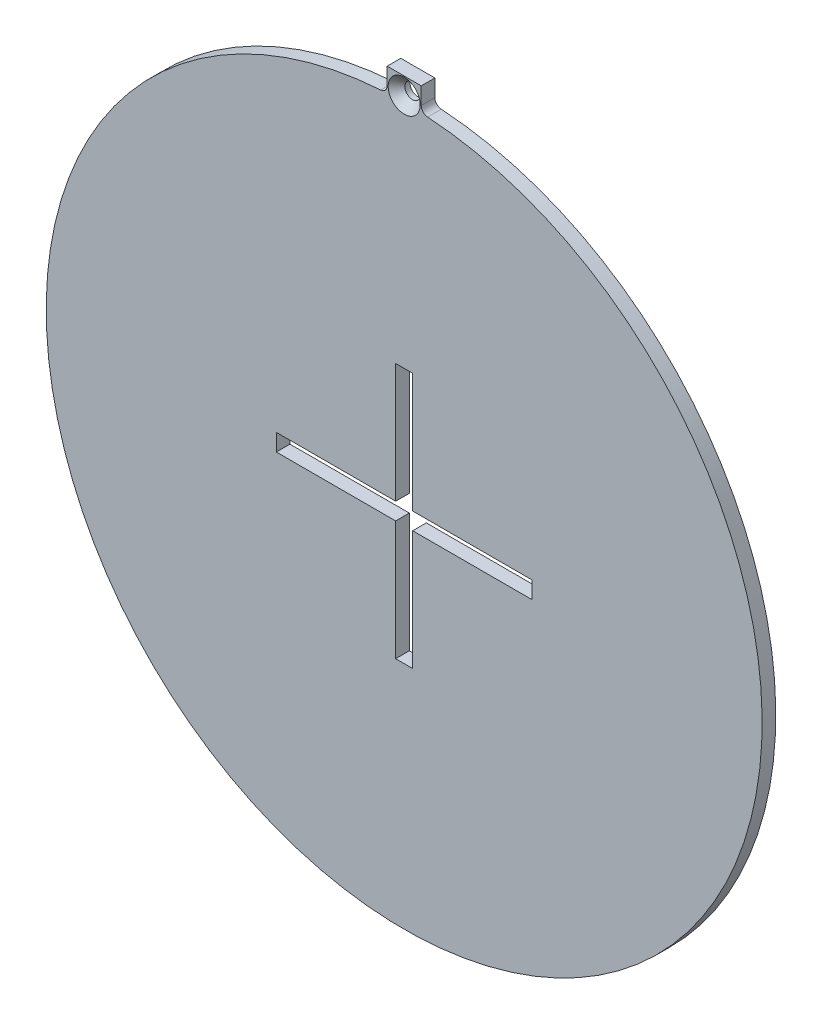
ISO-10303-21;
HEADER;
FILE_DESCRIPTION(('STEP AP214'),'2;1');
FILE_NAME('part.step','',(''),(''),'','','');
FILE_SCHEMA(('AUTOMOTIVE_DESIGN { 1 0 10303 214 1 1 1 1 }'));
ENDSEC;
DATA;
#1=APPLICATION_CONTEXT('core data for automotive mechanical design processes');
#2=APPLICATION_PROTOCOL_DEFINITION('international standard','automotive_design',2000,#1);
#3=PRODUCT_CONTEXT('',#1,'mechanical');
#4=PRODUCT('Part','Part','',(#3));
#5=PRODUCT_RELATED_PRODUCT_CATEGORY('part','',(#4));
#6=PRODUCT_DEFINITION_FORMATION('','',#4);
#7=PRODUCT_DEFINITION_CONTEXT('part definition',#1,'design');
#8=PRODUCT_DEFINITION('design','',#6,#7);
#9=PRODUCT_DEFINITION_SHAPE('','',#8);
#10=(LENGTH_UNIT() NAMED_UNIT(*) SI_UNIT(.MILLI.,.METRE.));
#11=(NAMED_UNIT(*) PLANE_ANGLE_UNIT() SI_UNIT($,.RADIAN.));
#12=(NAMED_UNIT(*) SI_UNIT($,.STERADIAN.) SOLID_ANGLE_UNIT());
#13=UNCERTAINTY_MEASURE_WITH_UNIT(LENGTH_MEASURE(1.E-05),#10,'distance_accuracy_value','');
#14=(GEOMETRIC_REPRESENTATION_CONTEXT(3) GLOBAL_UNCERTAINTY_ASSIGNED_CONTEXT((#13)) GLOBAL_UNIT_ASSIGNED_CONTEXT((#10,
#11,#12)) REPRESENTATION_CONTEXT('',''));
#15=CARTESIAN_POINT('',(0.,0.,0.));
#16=DIRECTION('',(0.,0.,1.));
#17=DIRECTION('',(1.,0.,0.));
#18=AXIS2_PLACEMENT_3D('',#15,#16,#17);
#19=CARTESIAN_POINT('',(7.,106.770782520313,4.));
#20=DIRECTION('',(0.,0.,-1.));
#21=DIRECTION('',(-1.,0.,0.));
#22=AXIS2_PLACEMENT_3D('',#19,#20,#21);
#23=PLANE('',#22);
#24=DIRECTION('',(-1.,0.,0.));
#25=VECTOR('',#24,1.);
#26=CARTESIAN_POINT('',(2.5,37.5,4.));
#27=LINE('',#26,#25);
#28=CARTESIAN_POINT('',(2.5,37.5,4.));
#29=VERTEX_POINT('',#28);
#30=CARTESIAN_POINT('',(-2.5,37.5,4.));
#31=VERTEX_POINT('',#30);
#32=EDGE_CURVE('E184',#29,#31,#27,.T.);
#33=ORIENTED_EDGE('',*,*,#32,.F.);
#34=DIRECTION('',(0.,1.,0.));
#35=VECTOR('',#34,1.);
#36=CARTESIAN_POINT('',(2.5,37.5,4.));
#37=LINE('',#36,#35);
#38=CARTESIAN_POINT('',(2.5,2.5,4.));
#39=VERTEX_POINT('',#38);
#40=EDGE_CURVE('E166',#39,#29,#37,.T.);
#41=ORIENTED_EDGE('',*,*,#40,.F.);
#42=DIRECTION('',(-1.,0.,0.));
#43=VECTOR('',#42,1.);
#44=CARTESIAN_POINT('',(37.5,2.49999999999999,4.));
#45=LINE('',#44,#43);
#46=CARTESIAN_POINT('',(37.5,2.49999999999998,4.));
#47=VERTEX_POINT('',#46);
#48=EDGE_CURVE('E175',#47,#39,#45,.T.);
#49=ORIENTED_EDGE('',*,*,#48,.F.);
#50=DIRECTION('',(0.,1.,0.));
#51=VECTOR('',#50,1.);
#52=CARTESIAN_POINT('',(37.5,2.49999999999999,4.));
#53=LINE('',#52,#51);
#54=CARTESIAN_POINT('',(37.5,-2.50000000000001,4.));
#55=VERTEX_POINT('',#54);
#56=EDGE_CURVE('E54',#55,#47,#53,.T.);
#57=ORIENTED_EDGE('',*,*,#56,.F.);
#58=DIRECTION('',(1.,0.,0.));
#59=VECTOR('',#58,1.);
#60=CARTESIAN_POINT('',(37.5,-2.50000000000001,4.));
#61=LINE('',#60,#59);
#62=CARTESIAN_POINT('',(2.5,-2.5,4.));
#63=VERTEX_POINT('',#62);
#64=EDGE_CURVE('E390',#63,#55,#61,.T.);
#65=ORIENTED_EDGE('',*,*,#64,.F.);
#66=DIRECTION('',(0.,1.,0.));
#67=VECTOR('',#66,1.);
#68=CARTESIAN_POINT('',(2.5,-2.5,4.));
#69=LINE('',#68,#67);
#70=CARTESIAN_POINT('',(2.49999999999999,-37.5,4.));
#71=VERTEX_POINT('',#70);
#72=EDGE_CURVE('E393',#71,#63,#69,.T.);
#73=ORIENTED_EDGE('',*,*,#72,.F.);
#74=DIRECTION('',(1.,0.,0.));
#75=VECTOR('',#74,1.);
#76=CARTESIAN_POINT('',(2.49999999999999,-37.5,4.));
#77=LINE('',#76,#75);
#78=CARTESIAN_POINT('',(-2.50000000000001,-37.5,4.));
#79=VERTEX_POINT('',#78);
#80=EDGE_CURVE('E396',#79,#71,#77,.T.);
#81=ORIENTED_EDGE('',*,*,#80,.F.);
#82=DIRECTION('',(0.,-1.,0.));
#83=VECTOR('',#82,1.);
#84=CARTESIAN_POINT('',(-2.5,-2.5,4.));
#85=LINE('',#84,#83);
#86=CARTESIAN_POINT('',(-2.5,-2.5,4.));
#87=VERTEX_POINT('',#86);
#88=EDGE_CURVE('E399',#87,#79,#85,.T.);
#89=ORIENTED_EDGE('',*,*,#88,.F.);
#90=DIRECTION('',(1.,0.,0.));
#91=VECTOR('',#90,1.);
#92=CARTESIAN_POINT('',(-2.5,-2.5,4.));
#93=LINE('',#92,#91);
#94=CARTESIAN_POINT('',(-37.5,-2.50000000000001,4.));
#95=VERTEX_POINT('',#94);
#96=EDGE_CURVE('E402',#95,#87,#93,.T.);
#97=ORIENTED_EDGE('',*,*,#96,.F.);
#98=DIRECTION('',(0.,-1.,0.));
#99=VECTOR('',#98,1.);
#100=CARTESIAN_POINT('',(-37.5,2.49999999999999,4.));
#101=LINE('',#100,#99);
#102=CARTESIAN_POINT('',(-37.5,2.49999999999999,4.));
#103=VERTEX_POINT('',#102);
#104=EDGE_CURVE('E405',#103,#95,#101,.T.);
#105=ORIENTED_EDGE('',*,*,#104,.F.);
#106=DIRECTION('',(-1.,0.,0.));
#107=VECTOR('',#106,1.);
#108=CARTESIAN_POINT('',(-2.5,2.5,4.));
#109=LINE('',#108,#107);
#110=CARTESIAN_POINT('',(-2.5,2.5,4.));
#111=VERTEX_POINT('',#110);
#112=EDGE_CURVE('E408',#111,#103,#109,.T.);
#113=ORIENTED_EDGE('',*,*,#112,.F.);
#114=DIRECTION('',(0.,-1.,0.));
#115=VECTOR('',#114,1.);
#116=CARTESIAN_POINT('',(-2.5,37.5,4.));
#117=LINE('',#116,#115);
#118=EDGE_CURVE('E188',#31,#111,#117,.T.);
#119=ORIENTED_EDGE('',*,*,#118,.F.);
#120=EDGE_LOOP('',(#33,#41,#49,#57,#65,#73,#81,#89,#97,#105,#113,#119));
#121=FACE_BOUND('',#120,.T.);
#122=DIRECTION('',(0.,-1.,0.));
#123=VECTOR('',#122,1.);
#124=CARTESIAN_POINT('',(-5.,106.770782520313,4.));
#125=LINE('',#124,#123);
#126=CARTESIAN_POINT('',(-5.,111.770782520313,4.));
#127=VERTEX_POINT('',#126);
#128=CARTESIAN_POINT('',(-5.,106.770782520313,4.));
#129=VERTEX_POINT('',#128);
#130=EDGE_CURVE('E242',#127,#129,#125,.T.);
#131=ORIENTED_EDGE('',*,*,#130,.T.);
#132=CARTESIAN_POINT('',(-7.,106.770782520313,4.));
#133=DIRECTION('',(0.,0.,-1.));
#134=DIRECTION('',(1.,0.,0.));
#135=AXIS2_PLACEMENT_3D('',#132,#133,#134);
#136=CIRCLE('',#135,2.);
#137=CARTESIAN_POINT('',(-6.86915887850467,104.775066959186,4.));
#138=VERTEX_POINT('',#137);
#139=EDGE_CURVE('E245',#129,#138,#136,.T.);
#140=ORIENTED_EDGE('',*,*,#139,.T.);
#141=CARTESIAN_POINT('',(0.,0.,4.));
#142=DIRECTION('',(0.,0.,1.));
#143=DIRECTION('',(1.,0.,0.));
#144=AXIS2_PLACEMENT_3D('',#141,#142,#143);
#145=CIRCLE('',#144,105.);
#146=CARTESIAN_POINT('',(6.86915887850467,104.775066959186,4.));
#147=VERTEX_POINT('',#146);
#148=EDGE_CURVE('E248',#138,#147,#145,.T.);
#149=ORIENTED_EDGE('',*,*,#148,.T.);
#150=CARTESIAN_POINT('',(7.,106.770782520313,4.));
#151=DIRECTION('',(0.,0.,-1.));
#152=DIRECTION('',(-1.,0.,0.));
#153=AXIS2_PLACEMENT_3D('',#150,#151,#152);
#154=CIRCLE('',#153,2.);
#155=CARTESIAN_POINT('',(5.,106.770782520313,4.));
#156=VERTEX_POINT('',#155);
#157=EDGE_CURVE('E250',#147,#156,#154,.T.);
#158=ORIENTED_EDGE('',*,*,#157,.T.);
#159=DIRECTION('',(0.,1.,0.));
#160=VECTOR('',#159,1.);
#161=CARTESIAN_POINT('',(5.,106.770782520313,4.));
#162=LINE('',#161,#160);
#163=CARTESIAN_POINT('',(5.,111.770782520313,4.));
#164=VERTEX_POINT('',#163);
#165=EDGE_CURVE('E252',#156,#164,#162,.T.);
#166=ORIENTED_EDGE('',*,*,#165,.T.);
#167=DIRECTION('',(-1.,0.,0.));
#168=VECTOR('',#167,1.);
#169=CARTESIAN_POINT('',(5.,111.770782520313,4.));
#170=LINE('',#169,#168);
#171=EDGE_CURVE('E254',#164,#127,#170,.T.);
#172=ORIENTED_EDGE('',*,*,#171,.T.);
#173=EDGE_LOOP('',(#131,#140,#149,#158,#166,#172));
#174=FACE_BOUND('',#173,.T.);
#175=CARTESIAN_POINT('',(0.,106.770782520313,4.));
#176=DIRECTION('',(0.,0.,1.));
#177=DIRECTION('',(1.,0.,0.));
#178=AXIS2_PLACEMENT_3D('',#175,#176,#177);
#179=CIRCLE('',#178,4.7);
#180=CARTESIAN_POINT('',(4.7,106.770782520313,4.));
#181=VERTEX_POINT('',#180);
#182=EDGE_CURVE('E382',#181,#181,#179,.T.);
#183=ORIENTED_EDGE('',*,*,#182,.F.);
#184=EDGE_LOOP('',(#183));
#185=FACE_BOUND('',#184,.T.);
#186=ADVANCED_FACE('F39',(#121,#174,#185),#23,.F.);
#187=CARTESIAN_POINT('',(-5.,106.770782520313,4.));
#188=DIRECTION('',(1.,0.,0.));
#189=DIRECTION('',(0.,0.,-1.));
#190=AXIS2_PLACEMENT_3D('',#187,#188,#189);
#191=PLANE('',#190);
#192=DIRECTION('',(0.,-1.,0.));
#193=VECTOR('',#192,1.);
#194=CARTESIAN_POINT('',(-5.,106.770782520313,0.));
#195=LINE('',#194,#193);
#196=CARTESIAN_POINT('',(-5.,111.770782520313,0.));
#197=VERTEX_POINT('',#196);
#198=CARTESIAN_POINT('',(-5.,106.770782520313,0.));
#199=VERTEX_POINT('',#198);
#200=EDGE_CURVE('E178',#197,#199,#195,.T.);
#201=ORIENTED_EDGE('',*,*,#200,.T.);
#202=DIRECTION('',(0.,0.,-1.));
#203=VECTOR('',#202,1.);
#204=CARTESIAN_POINT('',(-5.,106.770782520313,4.));
#205=LINE('',#204,#203);
#206=EDGE_CURVE('E11',#129,#199,#205,.T.);
#207=ORIENTED_EDGE('',*,*,#206,.F.);
#208=ORIENTED_EDGE('',*,*,#130,.F.);
#209=DIRECTION('',(0.,0.,-1.));
#210=VECTOR('',#209,1.);
#211=CARTESIAN_POINT('',(-5.,111.770782520313,4.));
#212=LINE('',#211,#210);
#213=EDGE_CURVE('E256',#127,#197,#212,.T.);
#214=ORIENTED_EDGE('',*,*,#213,.T.);
#215=EDGE_LOOP('',(#201,#207,#208,#214));
#216=FACE_BOUND('',#215,.T.);
#217=ADVANCED_FACE('F41',(#216),#191,.F.);
#218=CARTESIAN_POINT('',(-7.,106.770782520313,4.));
#219=DIRECTION('',(0.,0.,-1.));
#220=DIRECTION('',(-1.,0.,0.));
#221=AXIS2_PLACEMENT_3D('',#218,#219,#220);
#222=CYLINDRICAL_SURFACE('',#221,2.);
#223=CARTESIAN_POINT('',(-7.,106.770782520313,0.));
#224=DIRECTION('',(0.,0.,-1.));
#225=DIRECTION('',(1.,0.,0.));
#226=AXIS2_PLACEMENT_3D('',#223,#224,#225);
#227=CIRCLE('',#226,2.);
#228=CARTESIAN_POINT('',(-6.86915887850467,104.775066959186,0.));
#229=VERTEX_POINT('',#228);
#230=EDGE_CURVE('E259',#199,#229,#227,.T.);
#231=ORIENTED_EDGE('',*,*,#230,.T.);
#232=DIRECTION('',(0.,0.,-1.));
#233=VECTOR('',#232,1.);
#234=CARTESIAN_POINT('',(-6.86915887850467,104.775066959186,4.));
#235=LINE('',#234,#233);
#236=EDGE_CURVE('E47',#138,#229,#235,.T.);
#237=ORIENTED_EDGE('',*,*,#236,.F.);
#238=ORIENTED_EDGE('',*,*,#139,.F.);
#239=ORIENTED_EDGE('',*,*,#206,.T.);
#240=EDGE_LOOP('',(#231,#237,#238,#239));
#241=FACE_BOUND('',#240,.T.);
#242=ADVANCED_FACE('F305',(#241),#222,.F.);
#243=CARTESIAN_POINT('',(0.,0.,4.));
#244=DIRECTION('',(0.,0.,-1.));
#245=DIRECTION('',(-1.,0.,0.));
#246=AXIS2_PLACEMENT_3D('',#243,#244,#245);
#247=CYLINDRICAL_SURFACE('',#246,105.);
#248=CARTESIAN_POINT('',(0.,0.,0.));
#249=DIRECTION('',(0.,0.,1.));
#250=DIRECTION('',(1.,0.,0.));
#251=AXIS2_PLACEMENT_3D('',#248,#249,#250);
#252=CIRCLE('',#251,105.);
#253=CARTESIAN_POINT('',(6.86915887850467,104.775066959186,0.));
#254=VERTEX_POINT('',#253);
#255=EDGE_CURVE('E261',#229,#254,#252,.T.);
#256=ORIENTED_EDGE('',*,*,#255,.T.);
#257=DIRECTION('',(0.,0.,-1.));
#258=VECTOR('',#257,1.);
#259=CARTESIAN_POINT('',(6.86915887850467,104.775066959186,4.));
#260=LINE('',#259,#258);
#261=EDGE_CURVE('E276',#147,#254,#260,.T.);
#262=ORIENTED_EDGE('',*,*,#261,.F.);
#263=ORIENTED_EDGE('',*,*,#148,.F.);
#264=ORIENTED_EDGE('',*,*,#236,.T.);
#265=EDGE_LOOP('',(#256,#262,#263,#264));
#266=FACE_BOUND('',#265,.T.);
#267=ADVANCED_FACE('F283',(#266),#247,.T.);
#268=CARTESIAN_POINT('',(7.,106.770782520313,4.));
#269=DIRECTION('',(0.,0.,-1.));
#270=DIRECTION('',(-1.,0.,0.));
#271=AXIS2_PLACEMENT_3D('',#268,#269,#270);
#272=CYLINDRICAL_SURFACE('',#271,2.);
#273=CARTESIAN_POINT('',(7.,106.770782520313,0.));
#274=DIRECTION('',(0.,0.,-1.));
#275=DIRECTION('',(-1.,0.,0.));
#276=AXIS2_PLACEMENT_3D('',#273,#274,#275);
#277=CIRCLE('',#276,2.);
#278=CARTESIAN_POINT('',(5.,106.770782520313,0.));
#279=VERTEX_POINT('',#278);
#280=EDGE_CURVE('E263',#254,#279,#277,.T.);
#281=ORIENTED_EDGE('',*,*,#280,.T.);
#282=DIRECTION('',(0.,0.,-1.));
#283=VECTOR('',#282,1.);
#284=CARTESIAN_POINT('',(5.,106.770782520313,4.));
#285=LINE('',#284,#283);
#286=EDGE_CURVE('E273',#156,#279,#285,.T.);
#287=ORIENTED_EDGE('',*,*,#286,.F.);
#288=ORIENTED_EDGE('',*,*,#157,.F.);
#289=ORIENTED_EDGE('',*,*,#261,.T.);
#290=EDGE_LOOP('',(#281,#287,#288,#289));
#291=FACE_BOUND('',#290,.T.);
#292=ADVANCED_FACE('F294',(#291),#272,.F.);
#293=CARTESIAN_POINT('',(5.,106.770782520313,4.));
#294=DIRECTION('',(-1.,0.,0.));
#295=DIRECTION('',(0.,0.,1.));
#296=AXIS2_PLACEMENT_3D('',#293,#294,#295);
#297=PLANE('',#296);
#298=DIRECTION('',(0.,1.,0.));
#299=VECTOR('',#298,1.);
#300=CARTESIAN_POINT('',(5.,106.770782520313,0.));
#301=LINE('',#300,#299);
#302=CARTESIAN_POINT('',(5.,111.770782520313,0.));
#303=VERTEX_POINT('',#302);
#304=EDGE_CURVE('E265',#279,#303,#301,.T.);
#305=ORIENTED_EDGE('',*,*,#304,.T.);
#306=DIRECTION('',(0.,0.,-1.));
#307=VECTOR('',#306,1.);
#308=CARTESIAN_POINT('',(5.,111.770782520313,4.));
#309=LINE('',#308,#307);
#310=EDGE_CURVE('E270',#164,#303,#309,.T.);
#311=ORIENTED_EDGE('',*,*,#310,.F.);
#312=ORIENTED_EDGE('',*,*,#165,.F.);
#313=ORIENTED_EDGE('',*,*,#286,.T.);
#314=EDGE_LOOP('',(#305,#311,#312,#313));
#315=FACE_BOUND('',#314,.T.);
#316=ADVANCED_FACE('F298',(#315),#297,.F.);
#317=CARTESIAN_POINT('',(5.,111.770782520313,4.));
#318=DIRECTION('',(0.,-1.,0.));
#319=DIRECTION('',(0.,0.,-1.));
#320=AXIS2_PLACEMENT_3D('',#317,#318,#319);
#321=PLANE('',#320);
#322=DIRECTION('',(-1.,0.,0.));
#323=VECTOR('',#322,1.);
#324=CARTESIAN_POINT('',(5.,111.770782520313,0.));
#325=LINE('',#324,#323);
#326=EDGE_CURVE('E246',#303,#197,#325,.T.);
#327=ORIENTED_EDGE('',*,*,#326,.T.);
#328=ORIENTED_EDGE('',*,*,#213,.F.);
#329=ORIENTED_EDGE('',*,*,#171,.F.);
#330=ORIENTED_EDGE('',*,*,#310,.T.);
#331=EDGE_LOOP('',(#327,#328,#329,#330));
#332=FACE_BOUND('',#331,.T.);
#333=ADVANCED_FACE('F308',(#332),#321,.F.);
#334=CARTESIAN_POINT('',(7.,106.770782520313,0.));
#335=DIRECTION('',(0.,0.,-1.));
#336=DIRECTION('',(-1.,0.,0.));
#337=AXIS2_PLACEMENT_3D('',#334,#335,#336);
#338=PLANE('',#337);
#339=CARTESIAN_POINT('',(0.,106.770782520313,0.));
#340=DIRECTION('',(0.,0.,-1.));
#341=DIRECTION('',(-1.,0.,0.));
#342=AXIS2_PLACEMENT_3D('',#339,#340,#341);
#343=CIRCLE('',#342,2.25);
#344=CARTESIAN_POINT('',(-2.25,106.770782520313,0.));
#345=VERTEX_POINT('',#344);
#346=EDGE_CURVE('E384',#345,#345,#343,.T.);
#347=ORIENTED_EDGE('',*,*,#346,.F.);
#348=EDGE_LOOP('',(#347));
#349=FACE_BOUND('',#348,.T.);
#350=DIRECTION('',(0.,-1.,0.));
#351=VECTOR('',#350,1.);
#352=CARTESIAN_POINT('',(2.5,37.5,0.));
#353=LINE('',#352,#351);
#354=CARTESIAN_POINT('',(2.5,37.5,0.));
#355=VERTEX_POINT('',#354);
#356=CARTESIAN_POINT('',(2.5,2.49999999999999,0.));
#357=VERTEX_POINT('',#356);
#358=EDGE_CURVE('E62',#355,#357,#353,.T.);
#359=ORIENTED_EDGE('',*,*,#358,.F.);
#360=DIRECTION('',(1.,0.,0.));
#361=VECTOR('',#360,1.);
#362=CARTESIAN_POINT('',(2.5,37.5,0.));
#363=LINE('',#362,#361);
#364=CARTESIAN_POINT('',(-2.5,37.5,0.));
#365=VERTEX_POINT('',#364);
#366=EDGE_CURVE('E172',#365,#355,#363,.T.);
#367=ORIENTED_EDGE('',*,*,#366,.F.);
#368=DIRECTION('',(0.,1.,0.));
#369=VECTOR('',#368,1.);
#370=CARTESIAN_POINT('',(-2.5,37.5,0.));
#371=LINE('',#370,#369);
#372=CARTESIAN_POINT('',(-2.5,2.5,0.));
#373=VERTEX_POINT('',#372);
#374=EDGE_CURVE('E217',#373,#365,#371,.T.);
#375=ORIENTED_EDGE('',*,*,#374,.F.);
#376=DIRECTION('',(1.,0.,0.));
#377=VECTOR('',#376,1.);
#378=CARTESIAN_POINT('',(-2.5,2.5,0.));
#379=LINE('',#378,#377);
#380=CARTESIAN_POINT('',(-37.5,2.49999999999999,0.));
#381=VERTEX_POINT('',#380);
#382=EDGE_CURVE('E214',#381,#373,#379,.T.);
#383=ORIENTED_EDGE('',*,*,#382,.F.);
#384=DIRECTION('',(0.,1.,0.));
#385=VECTOR('',#384,1.);
#386=CARTESIAN_POINT('',(-37.5,2.49999999999999,0.));
#387=LINE('',#386,#385);
#388=CARTESIAN_POINT('',(-37.5,-2.50000000000001,0.));
#389=VERTEX_POINT('',#388);
#390=EDGE_CURVE('E211',#389,#381,#387,.T.);
#391=ORIENTED_EDGE('',*,*,#390,.F.);
#392=DIRECTION('',(-1.,0.,0.));
#393=VECTOR('',#392,1.);
#394=CARTESIAN_POINT('',(-2.5,-2.5,0.));
#395=LINE('',#394,#393);
#396=CARTESIAN_POINT('',(-2.5,-2.5,0.));
#397=VERTEX_POINT('',#396);
#398=EDGE_CURVE('E208',#397,#389,#395,.T.);
#399=ORIENTED_EDGE('',*,*,#398,.F.);
#400=DIRECTION('',(0.,1.,0.));
#401=VECTOR('',#400,1.);
#402=CARTESIAN_POINT('',(-2.5,-2.5,0.));
#403=LINE('',#402,#401);
#404=CARTESIAN_POINT('',(-2.50000000000001,-37.5,0.));
#405=VERTEX_POINT('',#404);
#406=EDGE_CURVE('E205',#405,#397,#403,.T.);
#407=ORIENTED_EDGE('',*,*,#406,.F.);
#408=DIRECTION('',(-1.,0.,0.));
#409=VECTOR('',#408,1.);
#410=CARTESIAN_POINT('',(2.49999999999999,-37.5,0.));
#411=LINE('',#410,#409);
#412=CARTESIAN_POINT('',(2.49999999999999,-37.5,0.));
#413=VERTEX_POINT('',#412);
#414=EDGE_CURVE('E202',#413,#405,#411,.T.);
#415=ORIENTED_EDGE('',*,*,#414,.F.);
#416=DIRECTION('',(0.,-1.,0.));
#417=VECTOR('',#416,1.);
#418=CARTESIAN_POINT('',(2.5,-2.5,0.));
#419=LINE('',#418,#417);
#420=CARTESIAN_POINT('',(2.5,-2.5,0.));
#421=VERTEX_POINT('',#420);
#422=EDGE_CURVE('E199',#421,#413,#419,.T.);
#423=ORIENTED_EDGE('',*,*,#422,.F.);
#424=DIRECTION('',(-1.,0.,0.));
#425=VECTOR('',#424,1.);
#426=CARTESIAN_POINT('',(37.5,-2.50000000000001,0.));
#427=LINE('',#426,#425);
#428=CARTESIAN_POINT('',(37.5,-2.50000000000001,0.));
#429=VERTEX_POINT('',#428);
#430=EDGE_CURVE('E196',#429,#421,#427,.T.);
#431=ORIENTED_EDGE('',*,*,#430,.F.);
#432=DIRECTION('',(0.,-1.,0.));
#433=VECTOR('',#432,1.);
#434=CARTESIAN_POINT('',(37.5,2.49999999999999,0.));
#435=LINE('',#434,#433);
#436=CARTESIAN_POINT('',(37.5,2.49999999999999,0.));
#437=VERTEX_POINT('',#436);
#438=EDGE_CURVE('E193',#437,#429,#435,.T.);
#439=ORIENTED_EDGE('',*,*,#438,.F.);
#440=DIRECTION('',(1.,0.,0.));
#441=VECTOR('',#440,1.);
#442=CARTESIAN_POINT('',(37.5,2.49999999999999,0.));
#443=LINE('',#442,#441);
#444=EDGE_CURVE('E186',#357,#437,#443,.T.);
#445=ORIENTED_EDGE('',*,*,#444,.F.);
#446=EDGE_LOOP('',(#359,#367,#375,#383,#391,#399,#407,#415,#423,#431,#439,#445));
#447=FACE_BOUND('',#446,.T.);
#448=ORIENTED_EDGE('',*,*,#200,.F.);
#449=ORIENTED_EDGE('',*,*,#326,.F.);
#450=ORIENTED_EDGE('',*,*,#304,.F.);
#451=ORIENTED_EDGE('',*,*,#280,.F.);
#452=ORIENTED_EDGE('',*,*,#255,.F.);
#453=ORIENTED_EDGE('',*,*,#230,.F.);
#454=EDGE_LOOP('',(#448,#449,#450,#451,#452,#453));
#455=FACE_BOUND('',#454,.T.);
#456=ADVANCED_FACE('F289',(#349,#447,#455),#338,.T.);
#457=CARTESIAN_POINT('',(2.5,37.5,4.001));
#458=DIRECTION('',(1.,0.,0.));
#459=DIRECTION('',(0.,1.,0.));
#460=AXIS2_PLACEMENT_3D('',#457,#458,#459);
#461=PLANE('',#460);
#462=ORIENTED_EDGE('',*,*,#40,.T.);
#463=DIRECTION('',(0.,0.,-1.));
#464=VECTOR('',#463,1.);
#465=CARTESIAN_POINT('',(2.5,37.5,4.001));
#466=LINE('',#465,#464);
#467=EDGE_CURVE('E179',#29,#355,#466,.T.);
#468=ORIENTED_EDGE('',*,*,#467,.T.);
#469=ORIENTED_EDGE('',*,*,#358,.T.);
#470=DIRECTION('',(0.,0.,-1.));
#471=VECTOR('',#470,1.);
#472=CARTESIAN_POINT('',(2.5,2.5,4.001));
#473=LINE('',#472,#471);
#474=EDGE_CURVE('E162',#39,#357,#473,.T.);
#475=ORIENTED_EDGE('',*,*,#474,.F.);
#476=EDGE_LOOP('',(#462,#468,#469,#475));
#477=FACE_BOUND('',#476,.T.);
#478=ADVANCED_FACE('F164',(#477),#461,.F.);
#479=CARTESIAN_POINT('',(2.5,37.5,4.001));
#480=DIRECTION('',(0.,1.,0.));
#481=DIRECTION('',(0.,0.,1.));
#482=AXIS2_PLACEMENT_3D('',#479,#480,#481);
#483=PLANE('',#482);
#484=ORIENTED_EDGE('',*,*,#32,.T.);
#485=DIRECTION('',(0.,0.,-1.));
#486=VECTOR('',#485,1.);
#487=CARTESIAN_POINT('',(-2.5,37.5,4.001));
#488=LINE('',#487,#486);
#489=EDGE_CURVE('E223',#31,#365,#488,.T.);
#490=ORIENTED_EDGE('',*,*,#489,.T.);
#491=ORIENTED_EDGE('',*,*,#366,.T.);
#492=ORIENTED_EDGE('',*,*,#467,.F.);
#493=EDGE_LOOP('',(#484,#490,#491,#492));
#494=FACE_BOUND('',#493,.T.);
#495=ADVANCED_FACE('F326',(#494),#483,.F.);
#496=CARTESIAN_POINT('',(-2.5,37.5,4.001));
#497=DIRECTION('',(-1.,0.,0.));
#498=DIRECTION('',(0.,-1.,0.));
#499=AXIS2_PLACEMENT_3D('',#496,#497,#498);
#500=PLANE('',#499);
#501=ORIENTED_EDGE('',*,*,#118,.T.);
#502=DIRECTION('',(0.,0.,-1.));
#503=VECTOR('',#502,1.);
#504=CARTESIAN_POINT('',(-2.5,2.5,4.001));
#505=LINE('',#504,#503);
#506=EDGE_CURVE('E225',#111,#373,#505,.T.);
#507=ORIENTED_EDGE('',*,*,#506,.T.);
#508=ORIENTED_EDGE('',*,*,#374,.T.);
#509=ORIENTED_EDGE('',*,*,#489,.F.);
#510=EDGE_LOOP('',(#501,#507,#508,#509));
#511=FACE_BOUND('',#510,.T.);
#512=ADVANCED_FACE('F360',(#511),#500,.F.);
#513=CARTESIAN_POINT('',(-2.5,2.5,4.001));
#514=DIRECTION('',(0.,1.,0.));
#515=DIRECTION('',(-1.,0.,0.));
#516=AXIS2_PLACEMENT_3D('',#513,#514,#515);
#517=PLANE('',#516);
#518=ORIENTED_EDGE('',*,*,#112,.T.);
#519=DIRECTION('',(0.,0.,-1.));
#520=VECTOR('',#519,1.);
#521=CARTESIAN_POINT('',(-37.5,2.49999999999999,4.001));
#522=LINE('',#521,#520);
#523=EDGE_CURVE('E227',#103,#381,#522,.T.);
#524=ORIENTED_EDGE('',*,*,#523,.T.);
#525=ORIENTED_EDGE('',*,*,#382,.T.);
#526=ORIENTED_EDGE('',*,*,#506,.F.);
#527=EDGE_LOOP('',(#518,#524,#525,#526));
#528=FACE_BOUND('',#527,.T.);
#529=ADVANCED_FACE('F356',(#528),#517,.F.);
#530=CARTESIAN_POINT('',(-37.5,2.49999999999999,4.001));
#531=DIRECTION('',(-1.,0.,0.));
#532=DIRECTION('',(0.,0.,1.));
#533=AXIS2_PLACEMENT_3D('',#530,#531,#532);
#534=PLANE('',#533);
#535=ORIENTED_EDGE('',*,*,#104,.T.);
#536=DIRECTION('',(0.,0.,-1.));
#537=VECTOR('',#536,1.);
#538=CARTESIAN_POINT('',(-37.5,-2.50000000000001,4.001));
#539=LINE('',#538,#537);
#540=EDGE_CURVE('E229',#95,#389,#539,.T.);
#541=ORIENTED_EDGE('',*,*,#540,.T.);
#542=ORIENTED_EDGE('',*,*,#390,.T.);
#543=ORIENTED_EDGE('',*,*,#523,.F.);
#544=EDGE_LOOP('',(#535,#541,#542,#543));
#545=FACE_BOUND('',#544,.T.);
#546=ADVANCED_FACE('F352',(#545),#534,.F.);
#547=CARTESIAN_POINT('',(-2.5,-2.5,4.001));
#548=DIRECTION('',(0.,-1.,0.));
#549=DIRECTION('',(1.,0.,0.));
#550=AXIS2_PLACEMENT_3D('',#547,#548,#549);
#551=PLANE('',#550);
#552=ORIENTED_EDGE('',*,*,#96,.T.);
#553=DIRECTION('',(0.,0.,-1.));
#554=VECTOR('',#553,1.);
#555=CARTESIAN_POINT('',(-2.5,-2.5,4.001));
#556=LINE('',#555,#554);
#557=EDGE_CURVE('E231',#87,#397,#556,.T.);
#558=ORIENTED_EDGE('',*,*,#557,.T.);
#559=ORIENTED_EDGE('',*,*,#398,.T.);
#560=ORIENTED_EDGE('',*,*,#540,.F.);
#561=EDGE_LOOP('',(#552,#558,#559,#560));
#562=FACE_BOUND('',#561,.T.);
#563=ADVANCED_FACE('F348',(#562),#551,.F.);
#564=CARTESIAN_POINT('',(-2.5,-2.5,4.001));
#565=DIRECTION('',(-1.,0.,0.));
#566=DIRECTION('',(0.,-1.,0.));
#567=AXIS2_PLACEMENT_3D('',#564,#565,#566);
#568=PLANE('',#567);
#569=ORIENTED_EDGE('',*,*,#88,.T.);
#570=DIRECTION('',(0.,0.,-1.));
#571=VECTOR('',#570,1.);
#572=CARTESIAN_POINT('',(-2.50000000000001,-37.5,4.001));
#573=LINE('',#572,#571);
#574=EDGE_CURVE('E233',#79,#405,#573,.T.);
#575=ORIENTED_EDGE('',*,*,#574,.T.);
#576=ORIENTED_EDGE('',*,*,#406,.T.);
#577=ORIENTED_EDGE('',*,*,#557,.F.);
#578=EDGE_LOOP('',(#569,#575,#576,#577));
#579=FACE_BOUND('',#578,.T.);
#580=ADVANCED_FACE('F344',(#579),#568,.F.);
#581=CARTESIAN_POINT('',(2.49999999999999,-37.5,4.001));
#582=DIRECTION('',(0.,-1.,0.));
#583=DIRECTION('',(0.,0.,-1.));
#584=AXIS2_PLACEMENT_3D('',#581,#582,#583);
#585=PLANE('',#584);
#586=ORIENTED_EDGE('',*,*,#80,.T.);
#587=DIRECTION('',(0.,0.,-1.));
#588=VECTOR('',#587,1.);
#589=CARTESIAN_POINT('',(2.49999999999999,-37.5,4.001));
#590=LINE('',#589,#588);
#591=EDGE_CURVE('E235',#71,#413,#590,.T.);
#592=ORIENTED_EDGE('',*,*,#591,.T.);
#593=ORIENTED_EDGE('',*,*,#414,.T.);
#594=ORIENTED_EDGE('',*,*,#574,.F.);
#595=EDGE_LOOP('',(#586,#592,#593,#594));
#596=FACE_BOUND('',#595,.T.);
#597=ADVANCED_FACE('F340',(#596),#585,.F.);
#598=CARTESIAN_POINT('',(2.5,-2.5,4.001));
#599=DIRECTION('',(1.,0.,0.));
#600=DIRECTION('',(0.,1.,0.));
#601=AXIS2_PLACEMENT_3D('',#598,#599,#600);
#602=PLANE('',#601);
#603=ORIENTED_EDGE('',*,*,#72,.T.);
#604=DIRECTION('',(0.,0.,-1.));
#605=VECTOR('',#604,1.);
#606=CARTESIAN_POINT('',(2.5,-2.5,4.001));
#607=LINE('',#606,#605);
#608=EDGE_CURVE('E237',#63,#421,#607,.T.);
#609=ORIENTED_EDGE('',*,*,#608,.T.);
#610=ORIENTED_EDGE('',*,*,#422,.T.);
#611=ORIENTED_EDGE('',*,*,#591,.F.);
#612=EDGE_LOOP('',(#603,#609,#610,#611));
#613=FACE_BOUND('',#612,.T.);
#614=ADVANCED_FACE('F336',(#613),#602,.F.);
#615=CARTESIAN_POINT('',(37.5,-2.50000000000001,4.001));
#616=DIRECTION('',(0.,-1.,0.));
#617=DIRECTION('',(1.,0.,0.));
#618=AXIS2_PLACEMENT_3D('',#615,#616,#617);
#619=PLANE('',#618);
#620=ORIENTED_EDGE('',*,*,#64,.T.);
#621=DIRECTION('',(0.,0.,-1.));
#622=VECTOR('',#621,1.);
#623=CARTESIAN_POINT('',(37.5,-2.50000000000001,4.001));
#624=LINE('',#623,#622);
#625=EDGE_CURVE('E239',#55,#429,#624,.T.);
#626=ORIENTED_EDGE('',*,*,#625,.T.);
#627=ORIENTED_EDGE('',*,*,#430,.T.);
#628=ORIENTED_EDGE('',*,*,#608,.F.);
#629=EDGE_LOOP('',(#620,#626,#627,#628));
#630=FACE_BOUND('',#629,.T.);
#631=ADVANCED_FACE('F333',(#630),#619,.F.);
#632=CARTESIAN_POINT('',(37.5,2.49999999999999,4.001));
#633=DIRECTION('',(1.,0.,0.));
#634=DIRECTION('',(0.,0.,-1.));
#635=AXIS2_PLACEMENT_3D('',#632,#633,#634);
#636=PLANE('',#635);
#637=ORIENTED_EDGE('',*,*,#56,.T.);
#638=DIRECTION('',(0.,0.,-1.));
#639=VECTOR('',#638,1.);
#640=CARTESIAN_POINT('',(37.5,2.49999999999999,4.001));
#641=LINE('',#640,#639);
#642=EDGE_CURVE('E171',#47,#437,#641,.T.);
#643=ORIENTED_EDGE('',*,*,#642,.T.);
#644=ORIENTED_EDGE('',*,*,#438,.T.);
#645=ORIENTED_EDGE('',*,*,#625,.F.);
#646=EDGE_LOOP('',(#637,#643,#644,#645));
#647=FACE_BOUND('',#646,.T.);
#648=ADVANCED_FACE('F330',(#647),#636,.F.);
#649=CARTESIAN_POINT('',(37.5,2.49999999999999,4.001));
#650=DIRECTION('',(0.,1.,0.));
#651=DIRECTION('',(-1.,0.,0.));
#652=AXIS2_PLACEMENT_3D('',#649,#650,#651);
#653=PLANE('',#652);
#654=ORIENTED_EDGE('',*,*,#48,.T.);
#655=ORIENTED_EDGE('',*,*,#474,.T.);
#656=ORIENTED_EDGE('',*,*,#444,.T.);
#657=ORIENTED_EDGE('',*,*,#642,.F.);
#658=EDGE_LOOP('',(#654,#655,#656,#657));
#659=FACE_BOUND('',#658,.T.);
#660=ADVANCED_FACE('F176',(#659),#653,.F.);
#661=CARTESIAN_POINT('',(0.,106.770782520313,4.));
#662=DIRECTION('',(0.,0.,1.));
#663=DIRECTION('',(1.,0.,0.));
#664=AXIS2_PLACEMENT_3D('',#661,#662,#663);
#665=CYLINDRICAL_SURFACE('',#664,2.25);
#666=CARTESIAN_POINT('',(0.,106.770782520313,1.55));
#667=DIRECTION('',(0.,0.,1.));
#668=DIRECTION('',(1.,0.,0.));
#669=AXIS2_PLACEMENT_3D('',#666,#667,#668);
#670=CIRCLE('',#669,2.25);
#671=CARTESIAN_POINT('',(2.25,106.770782520313,1.55));
#672=VERTEX_POINT('',#671);
#673=EDGE_CURVE('E379',#672,#672,#670,.T.);
#674=ORIENTED_EDGE('',*,*,#673,.T.);
#675=EDGE_LOOP('',(#674));
#676=FACE_BOUND('',#675,.T.);
#677=ORIENTED_EDGE('',*,*,#346,.T.);
#678=EDGE_LOOP('',(#677));
#679=FACE_BOUND('',#678,.T.);
#680=ADVANCED_FACE('F329',(#676,#679),#665,.F.);
#681=CARTESIAN_POINT('',(0.,106.770782520313,4.));
#682=DIRECTION('',(0.,0.,1.));
#683=DIRECTION('',(1.,0.,0.));
#684=AXIS2_PLACEMENT_3D('',#681,#682,#683);
#685=CONICAL_SURFACE('',#684,4.7,0.785398163397449);
#686=ORIENTED_EDGE('',*,*,#673,.F.);
#687=EDGE_LOOP('',(#686));
#688=FACE_BOUND('',#687,.T.);
#689=ORIENTED_EDGE('',*,*,#182,.T.);
#690=EDGE_LOOP('',(#689));
#691=FACE_BOUND('',#690,.T.);
#692=ADVANCED_FACE('F370',(#688,#691),#685,.F.);
#693=CLOSED_SHELL('',(#186,#217,#242,#267,#292,#316,#333,#456,#478,#495,#512,#529,#546,#563,
#580,#597,#614,#631,#648,#660,#680,#692));
#694=MANIFOLD_SOLID_BREP('B2',#693);
#695=ADVANCED_BREP_SHAPE_REPRESENTATION('',(#18,#694),#14);
#696=SHAPE_DEFINITION_REPRESENTATION(#9,#695);
ENDSEC;
END-ISO-10303-21;
